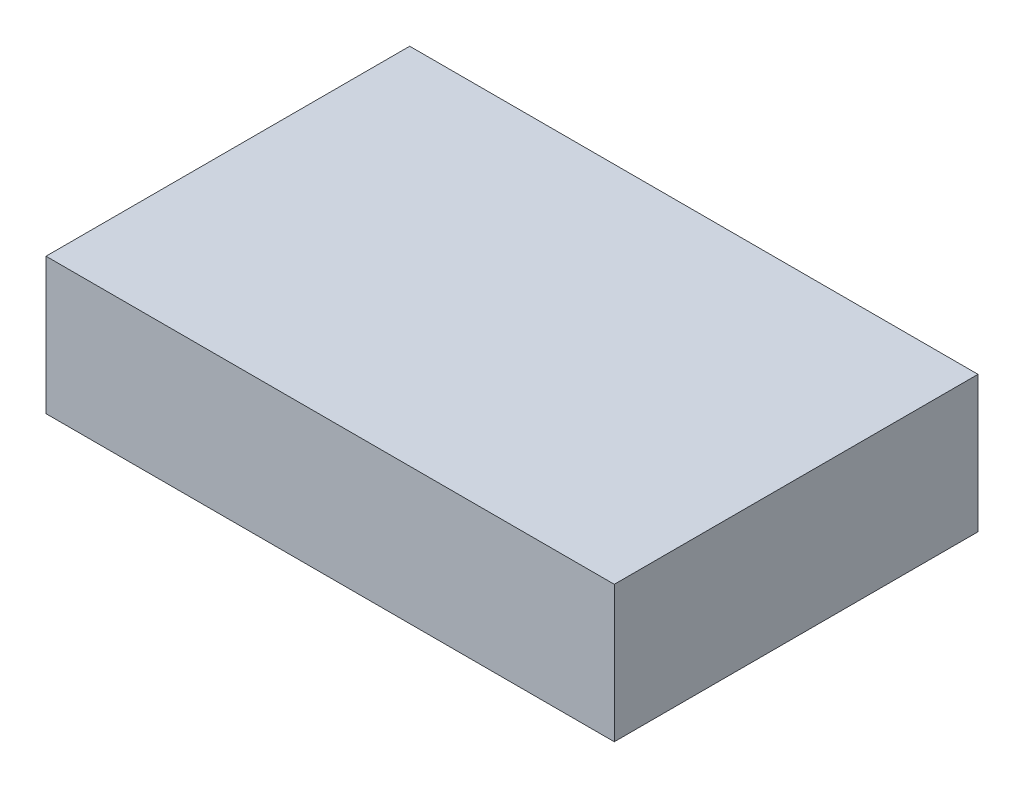
ISO-10303-21;
HEADER;
FILE_DESCRIPTION(('STEP AP214'),'2;1');
FILE_NAME('part.step','',(''),(''),'','','');
FILE_SCHEMA(('AUTOMOTIVE_DESIGN { 1 0 10303 214 1 1 1 1 }'));
ENDSEC;
DATA;
#1=APPLICATION_CONTEXT('core data for automotive mechanical design processes');
#2=APPLICATION_PROTOCOL_DEFINITION('international standard','automotive_design',2000,#1);
#3=PRODUCT_CONTEXT('',#1,'mechanical');
#4=PRODUCT('Part','Part','',(#3));
#5=PRODUCT_RELATED_PRODUCT_CATEGORY('part','',(#4));
#6=PRODUCT_DEFINITION_FORMATION('','',#4);
#7=PRODUCT_DEFINITION_CONTEXT('part definition',#1,'design');
#8=PRODUCT_DEFINITION('design','',#6,#7);
#9=PRODUCT_DEFINITION_SHAPE('','',#8);
#10=(LENGTH_UNIT() NAMED_UNIT(*) SI_UNIT(.MILLI.,.METRE.));
#11=(NAMED_UNIT(*) PLANE_ANGLE_UNIT() SI_UNIT($,.RADIAN.));
#12=(NAMED_UNIT(*) SI_UNIT($,.STERADIAN.) SOLID_ANGLE_UNIT());
#13=UNCERTAINTY_MEASURE_WITH_UNIT(LENGTH_MEASURE(1.E-05),#10,'distance_accuracy_value','');
#14=(GEOMETRIC_REPRESENTATION_CONTEXT(3) GLOBAL_UNCERTAINTY_ASSIGNED_CONTEXT((#13)) GLOBAL_UNIT_ASSIGNED_CONTEXT((#10,
#11,#12)) REPRESENTATION_CONTEXT('',''));
#15=CARTESIAN_POINT('',(0.,0.,0.));
#16=DIRECTION('',(0.,0.,1.));
#17=DIRECTION('',(1.,0.,0.));
#18=AXIS2_PLACEMENT_3D('',#15,#16,#17);
#19=CARTESIAN_POINT('',(62.5,-30.,-40.));
#20=DIRECTION('',(1.,0.,0.));
#21=DIRECTION('',(0.,0.,-1.));
#22=AXIS2_PLACEMENT_3D('',#19,#20,#21);
#23=PLANE('',#22);
#24=DIRECTION('',(0.,0.,-1.));
#25=VECTOR('',#24,1.);
#26=CARTESIAN_POINT('',(62.5,0.,-40.));
#27=LINE('',#26,#25);
#28=CARTESIAN_POINT('',(62.5,0.,40.));
#29=VERTEX_POINT('',#28);
#30=CARTESIAN_POINT('',(62.5,0.,-40.));
#31=VERTEX_POINT('',#30);
#32=EDGE_CURVE('E123',#29,#31,#27,.T.);
#33=ORIENTED_EDGE('',*,*,#32,.F.);
#34=DIRECTION('',(0.,1.,0.));
#35=VECTOR('',#34,1.);
#36=CARTESIAN_POINT('',(62.5,-30.,40.));
#37=LINE('',#36,#35);
#38=CARTESIAN_POINT('',(62.5,-30.,40.));
#39=VERTEX_POINT('',#38);
#40=EDGE_CURVE('E11',#39,#29,#37,.T.);
#41=ORIENTED_EDGE('',*,*,#40,.F.);
#42=DIRECTION('',(0.,0.,-1.));
#43=VECTOR('',#42,1.);
#44=CARTESIAN_POINT('',(62.5,-30.,-40.));
#45=LINE('',#44,#43);
#46=CARTESIAN_POINT('',(62.5,-30.,-40.));
#47=VERTEX_POINT('',#46);
#48=EDGE_CURVE('E155',#39,#47,#45,.T.);
#49=ORIENTED_EDGE('',*,*,#48,.T.);
#50=DIRECTION('',(0.,1.,0.));
#51=VECTOR('',#50,1.);
#52=CARTESIAN_POINT('',(62.5,-30.,-40.));
#53=LINE('',#52,#51);
#54=EDGE_CURVE('E45',#47,#31,#53,.T.);
#55=ORIENTED_EDGE('',*,*,#54,.T.);
#56=EDGE_LOOP('',(#33,#41,#49,#55));
#57=FACE_BOUND('',#56,.T.);
#58=ADVANCED_FACE('F39',(#57),#23,.T.);
#59=CARTESIAN_POINT('',(-62.5,-30.,40.));
#60=DIRECTION('',(0.,0.,1.));
#61=DIRECTION('',(1.,0.,0.));
#62=AXIS2_PLACEMENT_3D('',#59,#60,#61);
#63=PLANE('',#62);
#64=DIRECTION('',(1.,0.,0.));
#65=VECTOR('',#64,1.);
#66=CARTESIAN_POINT('',(-62.5,0.,40.));
#67=LINE('',#66,#65);
#68=CARTESIAN_POINT('',(-62.5,0.,40.));
#69=VERTEX_POINT('',#68);
#70=EDGE_CURVE('E154',#69,#29,#67,.T.);
#71=ORIENTED_EDGE('',*,*,#70,.F.);
#72=DIRECTION('',(0.,1.,0.));
#73=VECTOR('',#72,1.);
#74=CARTESIAN_POINT('',(-62.5,-30.,40.));
#75=LINE('',#74,#73);
#76=CARTESIAN_POINT('',(-62.5,-30.,40.));
#77=VERTEX_POINT('',#76);
#78=EDGE_CURVE('E50',#77,#69,#75,.T.);
#79=ORIENTED_EDGE('',*,*,#78,.F.);
#80=DIRECTION('',(1.,0.,0.));
#81=VECTOR('',#80,1.);
#82=CARTESIAN_POINT('',(-62.5,-30.,40.));
#83=LINE('',#82,#81);
#84=EDGE_CURVE('E159',#77,#39,#83,.T.);
#85=ORIENTED_EDGE('',*,*,#84,.T.);
#86=ORIENTED_EDGE('',*,*,#40,.T.);
#87=EDGE_LOOP('',(#71,#79,#85,#86));
#88=FACE_BOUND('',#87,.T.);
#89=ADVANCED_FACE('F180',(#88),#63,.T.);
#90=CARTESIAN_POINT('',(-62.5,-30.,-40.));
#91=DIRECTION('',(-1.,0.,0.));
#92=DIRECTION('',(0.,0.,1.));
#93=AXIS2_PLACEMENT_3D('',#90,#91,#92);
#94=PLANE('',#93);
#95=DIRECTION('',(0.,0.,1.));
#96=VECTOR('',#95,1.);
#97=CARTESIAN_POINT('',(-62.5,0.,-40.));
#98=LINE('',#97,#96);
#99=CARTESIAN_POINT('',(-62.5,0.,-40.));
#100=VERTEX_POINT('',#99);
#101=EDGE_CURVE('E170',#100,#69,#98,.T.);
#102=ORIENTED_EDGE('',*,*,#101,.F.);
#103=DIRECTION('',(0.,1.,0.));
#104=VECTOR('',#103,1.);
#105=CARTESIAN_POINT('',(-62.5,-30.,-40.));
#106=LINE('',#105,#104);
#107=CARTESIAN_POINT('',(-62.5,-30.,-40.));
#108=VERTEX_POINT('',#107);
#109=EDGE_CURVE('E171',#108,#100,#106,.T.);
#110=ORIENTED_EDGE('',*,*,#109,.F.);
#111=DIRECTION('',(0.,0.,1.));
#112=VECTOR('',#111,1.);
#113=CARTESIAN_POINT('',(-62.5,-30.,-40.));
#114=LINE('',#113,#112);
#115=EDGE_CURVE('E160',#108,#77,#114,.T.);
#116=ORIENTED_EDGE('',*,*,#115,.T.);
#117=ORIENTED_EDGE('',*,*,#78,.T.);
#118=EDGE_LOOP('',(#102,#110,#116,#117));
#119=FACE_BOUND('',#118,.T.);
#120=ADVANCED_FACE('F182',(#119),#94,.T.);
#121=CARTESIAN_POINT('',(-62.5,-30.,-40.));
#122=DIRECTION('',(0.,0.,-1.));
#123=DIRECTION('',(-1.,0.,0.));
#124=AXIS2_PLACEMENT_3D('',#121,#122,#123);
#125=PLANE('',#124);
#126=DIRECTION('',(-1.,0.,0.));
#127=VECTOR('',#126,1.);
#128=CARTESIAN_POINT('',(-62.5,0.,-40.));
#129=LINE('',#128,#127);
#130=EDGE_CURVE('E163',#31,#100,#129,.T.);
#131=ORIENTED_EDGE('',*,*,#130,.F.);
#132=ORIENTED_EDGE('',*,*,#54,.F.);
#133=DIRECTION('',(-1.,0.,0.));
#134=VECTOR('',#133,1.);
#135=CARTESIAN_POINT('',(-62.5,-30.,-40.));
#136=LINE('',#135,#134);
#137=EDGE_CURVE('E152',#47,#108,#136,.T.);
#138=ORIENTED_EDGE('',*,*,#137,.T.);
#139=ORIENTED_EDGE('',*,*,#109,.T.);
#140=EDGE_LOOP('',(#131,#132,#138,#139));
#141=FACE_BOUND('',#140,.T.);
#142=ADVANCED_FACE('F173',(#141),#125,.T.);
#143=CARTESIAN_POINT('',(0.,-30.,0.));
#144=DIRECTION('',(0.,1.,0.));
#145=DIRECTION('',(0.,0.,1.));
#146=AXIS2_PLACEMENT_3D('',#143,#144,#145);
#147=PLANE('',#146);
#148=DIRECTION('',(1.,0.,0.));
#149=VECTOR('',#148,1.);
#150=CARTESIAN_POINT('',(0.,-30.,37.));
#151=LINE('',#150,#149);
#152=CARTESIAN_POINT('',(-59.5,-30.,37.));
#153=VERTEX_POINT('',#152);
#154=CARTESIAN_POINT('',(59.5,-30.,37.));
#155=VERTEX_POINT('',#154);
#156=EDGE_CURVE('E150',#153,#155,#151,.T.);
#157=ORIENTED_EDGE('',*,*,#156,.T.);
#158=DIRECTION('',(0.,0.,-1.));
#159=VECTOR('',#158,1.);
#160=CARTESIAN_POINT('',(59.5,-30.,0.));
#161=LINE('',#160,#159);
#162=CARTESIAN_POINT('',(59.5,-30.,-37.));
#163=VERTEX_POINT('',#162);
#164=EDGE_CURVE('E119',#155,#163,#161,.T.);
#165=ORIENTED_EDGE('',*,*,#164,.T.);
#166=DIRECTION('',(-1.,0.,0.));
#167=VECTOR('',#166,1.);
#168=CARTESIAN_POINT('',(0.,-30.,-37.));
#169=LINE('',#168,#167);
#170=CARTESIAN_POINT('',(-59.5,-30.,-37.));
#171=VERTEX_POINT('',#170);
#172=EDGE_CURVE('E140',#163,#171,#169,.T.);
#173=ORIENTED_EDGE('',*,*,#172,.T.);
#174=DIRECTION('',(0.,0.,1.));
#175=VECTOR('',#174,1.);
#176=CARTESIAN_POINT('',(-59.5,-30.,0.));
#177=LINE('',#176,#175);
#178=EDGE_CURVE('E54',#171,#153,#177,.T.);
#179=ORIENTED_EDGE('',*,*,#178,.T.);
#180=EDGE_LOOP('',(#157,#165,#173,#179));
#181=FACE_BOUND('',#180,.T.);
#182=ORIENTED_EDGE('',*,*,#48,.F.);
#183=ORIENTED_EDGE('',*,*,#84,.F.);
#184=ORIENTED_EDGE('',*,*,#115,.F.);
#185=ORIENTED_EDGE('',*,*,#137,.F.);
#186=EDGE_LOOP('',(#182,#183,#184,#185));
#187=FACE_BOUND('',#186,.T.);
#188=ADVANCED_FACE('F181',(#181,#187),#147,.F.);
#189=CARTESIAN_POINT('',(0.,0.,0.));
#190=DIRECTION('',(0.,1.,0.));
#191=DIRECTION('',(0.,0.,1.));
#192=AXIS2_PLACEMENT_3D('',#189,#190,#191);
#193=PLANE('',#192);
#194=ORIENTED_EDGE('',*,*,#32,.T.);
#195=ORIENTED_EDGE('',*,*,#130,.T.);
#196=ORIENTED_EDGE('',*,*,#101,.T.);
#197=ORIENTED_EDGE('',*,*,#70,.T.);
#198=EDGE_LOOP('',(#194,#195,#196,#197));
#199=FACE_BOUND('',#198,.T.);
#200=ADVANCED_FACE('F178',(#199),#193,.T.);
#201=CARTESIAN_POINT('',(59.5,-30.,-40.));
#202=DIRECTION('',(1.,0.,0.));
#203=DIRECTION('',(0.,0.,-1.));
#204=AXIS2_PLACEMENT_3D('',#201,#202,#203);
#205=PLANE('',#204);
#206=DIRECTION('',(0.,0.,-1.));
#207=VECTOR('',#206,1.);
#208=CARTESIAN_POINT('',(59.5,-3.,0.));
#209=LINE('',#208,#207);
#210=CARTESIAN_POINT('',(59.5,-3.,37.));
#211=VERTEX_POINT('',#210);
#212=CARTESIAN_POINT('',(59.5,-3.,-37.));
#213=VERTEX_POINT('',#212);
#214=EDGE_CURVE('E111',#211,#213,#209,.T.);
#215=ORIENTED_EDGE('',*,*,#214,.T.);
#216=DIRECTION('',(0.,1.,0.));
#217=VECTOR('',#216,1.);
#218=CARTESIAN_POINT('',(59.5,-30.,-37.));
#219=LINE('',#218,#217);
#220=EDGE_CURVE('E142',#163,#213,#219,.T.);
#221=ORIENTED_EDGE('',*,*,#220,.F.);
#222=ORIENTED_EDGE('',*,*,#164,.F.);
#223=DIRECTION('',(0.,1.,0.));
#224=VECTOR('',#223,1.);
#225=CARTESIAN_POINT('',(59.5,-30.,37.));
#226=LINE('',#225,#224);
#227=EDGE_CURVE('E112',#155,#211,#226,.T.);
#228=ORIENTED_EDGE('',*,*,#227,.T.);
#229=EDGE_LOOP('',(#215,#221,#222,#228));
#230=FACE_BOUND('',#229,.T.);
#231=ADVANCED_FACE('F114',(#230),#205,.F.);
#232=CARTESIAN_POINT('',(-62.5,-30.,37.));
#233=DIRECTION('',(0.,0.,1.));
#234=DIRECTION('',(1.,0.,0.));
#235=AXIS2_PLACEMENT_3D('',#232,#233,#234);
#236=PLANE('',#235);
#237=DIRECTION('',(1.,0.,0.));
#238=VECTOR('',#237,1.);
#239=CARTESIAN_POINT('',(0.,-3.,37.));
#240=LINE('',#239,#238);
#241=CARTESIAN_POINT('',(-59.5,-3.,37.));
#242=VERTEX_POINT('',#241);
#243=EDGE_CURVE('E129',#242,#211,#240,.T.);
#244=ORIENTED_EDGE('',*,*,#243,.T.);
#245=ORIENTED_EDGE('',*,*,#227,.F.);
#246=ORIENTED_EDGE('',*,*,#156,.F.);
#247=DIRECTION('',(0.,1.,0.));
#248=VECTOR('',#247,1.);
#249=CARTESIAN_POINT('',(-59.5,-30.,37.));
#250=LINE('',#249,#248);
#251=EDGE_CURVE('E125',#153,#242,#250,.T.);
#252=ORIENTED_EDGE('',*,*,#251,.T.);
#253=EDGE_LOOP('',(#244,#245,#246,#252));
#254=FACE_BOUND('',#253,.T.);
#255=ADVANCED_FACE('F135',(#254),#236,.F.);
#256=CARTESIAN_POINT('',(-59.5,-30.,-40.));
#257=DIRECTION('',(-1.,0.,0.));
#258=DIRECTION('',(0.,0.,1.));
#259=AXIS2_PLACEMENT_3D('',#256,#257,#258);
#260=PLANE('',#259);
#261=DIRECTION('',(0.,0.,1.));
#262=VECTOR('',#261,1.);
#263=CARTESIAN_POINT('',(-59.5,-3.,0.));
#264=LINE('',#263,#262);
#265=CARTESIAN_POINT('',(-59.5,-3.,-37.));
#266=VERTEX_POINT('',#265);
#267=EDGE_CURVE('E132',#266,#242,#264,.T.);
#268=ORIENTED_EDGE('',*,*,#267,.T.);
#269=ORIENTED_EDGE('',*,*,#251,.F.);
#270=ORIENTED_EDGE('',*,*,#178,.F.);
#271=DIRECTION('',(0.,1.,0.));
#272=VECTOR('',#271,1.);
#273=CARTESIAN_POINT('',(-59.5,-30.,-37.));
#274=LINE('',#273,#272);
#275=EDGE_CURVE('E141',#171,#266,#274,.T.);
#276=ORIENTED_EDGE('',*,*,#275,.T.);
#277=EDGE_LOOP('',(#268,#269,#270,#276));
#278=FACE_BOUND('',#277,.T.);
#279=ADVANCED_FACE('F232',(#278),#260,.F.);
#280=CARTESIAN_POINT('',(-62.5,-30.,-37.));
#281=DIRECTION('',(0.,0.,-1.));
#282=DIRECTION('',(-1.,0.,0.));
#283=AXIS2_PLACEMENT_3D('',#280,#281,#282);
#284=PLANE('',#283);
#285=DIRECTION('',(-1.,0.,0.));
#286=VECTOR('',#285,1.);
#287=CARTESIAN_POINT('',(0.,-3.,-37.));
#288=LINE('',#287,#286);
#289=EDGE_CURVE('E134',#213,#266,#288,.T.);
#290=ORIENTED_EDGE('',*,*,#289,.T.);
#291=ORIENTED_EDGE('',*,*,#275,.F.);
#292=ORIENTED_EDGE('',*,*,#172,.F.);
#293=ORIENTED_EDGE('',*,*,#220,.T.);
#294=EDGE_LOOP('',(#290,#291,#292,#293));
#295=FACE_BOUND('',#294,.T.);
#296=ADVANCED_FACE('F243',(#295),#284,.F.);
#297=CARTESIAN_POINT('',(0.,-3.,0.));
#298=DIRECTION('',(0.,1.,0.));
#299=DIRECTION('',(0.,0.,1.));
#300=AXIS2_PLACEMENT_3D('',#297,#298,#299);
#301=PLANE('',#300);
#302=ORIENTED_EDGE('',*,*,#214,.F.);
#303=ORIENTED_EDGE('',*,*,#243,.F.);
#304=ORIENTED_EDGE('',*,*,#267,.F.);
#305=ORIENTED_EDGE('',*,*,#289,.F.);
#306=EDGE_LOOP('',(#302,#303,#304,#305));
#307=FACE_BOUND('',#306,.T.);
#308=ADVANCED_FACE('F130',(#307),#301,.F.);
#309=CLOSED_SHELL('',(#58,#89,#120,#142,#188,#200,#231,#255,#279,#296,#308));
#310=MANIFOLD_SOLID_BREP('B2',#309);
#311=ADVANCED_BREP_SHAPE_REPRESENTATION('',(#18,#310),#14);
#312=SHAPE_DEFINITION_REPRESENTATION(#9,#311);
ENDSEC;
END-ISO-10303-21;
